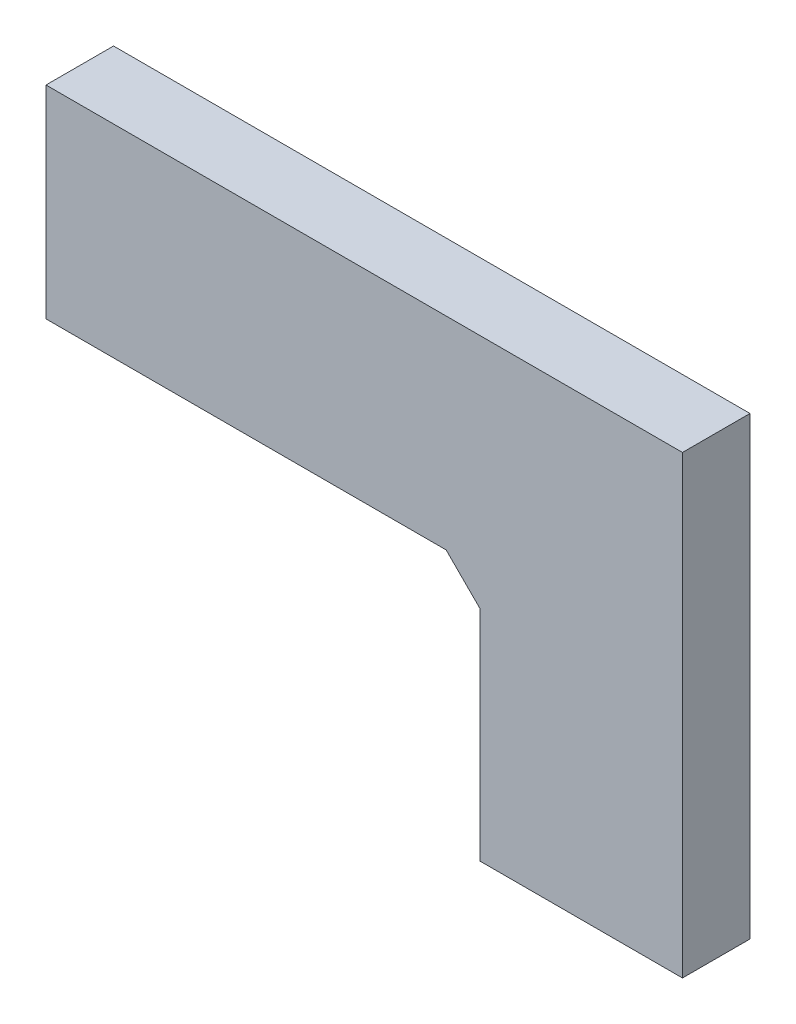
ISO-10303-21;
HEADER;
FILE_DESCRIPTION(('STEP AP214'),'2;1');
FILE_NAME('part.step','',(''),(''),'','','');
FILE_SCHEMA(('AUTOMOTIVE_DESIGN { 1 0 10303 214 1 1 1 1 }'));
ENDSEC;
DATA;
#1=APPLICATION_CONTEXT('core data for automotive mechanical design processes');
#2=APPLICATION_PROTOCOL_DEFINITION('international standard','automotive_design',2000,#1);
#3=PRODUCT_CONTEXT('',#1,'mechanical');
#4=PRODUCT('Part','Part','',(#3));
#5=PRODUCT_RELATED_PRODUCT_CATEGORY('part','',(#4));
#6=PRODUCT_DEFINITION_FORMATION('','',#4);
#7=PRODUCT_DEFINITION_CONTEXT('part definition',#1,'design');
#8=PRODUCT_DEFINITION('design','',#6,#7);
#9=PRODUCT_DEFINITION_SHAPE('','',#8);
#10=(LENGTH_UNIT() NAMED_UNIT(*) SI_UNIT(.MILLI.,.METRE.));
#11=(NAMED_UNIT(*) PLANE_ANGLE_UNIT() SI_UNIT($,.RADIAN.));
#12=(NAMED_UNIT(*) SI_UNIT($,.STERADIAN.) SOLID_ANGLE_UNIT());
#13=UNCERTAINTY_MEASURE_WITH_UNIT(LENGTH_MEASURE(1.E-05),#10,'distance_accuracy_value','');
#14=(GEOMETRIC_REPRESENTATION_CONTEXT(3) GLOBAL_UNCERTAINTY_ASSIGNED_CONTEXT((#13)) GLOBAL_UNIT_ASSIGNED_CONTEXT((#10,
#11,#12)) REPRESENTATION_CONTEXT('',''));
#15=CARTESIAN_POINT('',(0.,0.,0.));
#16=DIRECTION('',(0.,0.,1.));
#17=DIRECTION('',(1.,0.,0.));
#18=AXIS2_PLACEMENT_3D('',#15,#16,#17);
#19=CARTESIAN_POINT('',(0.,0.,0.5));
#20=DIRECTION('',(0.,0.,1.));
#21=DIRECTION('',(1.,0.,0.));
#22=AXIS2_PLACEMENT_3D('',#19,#20,#21);
#23=PLANE('',#22);
#24=DIRECTION('',(0.,-1.,0.));
#25=VECTOR('',#24,1.);
#26=CARTESIAN_POINT('',(13.077499999997,0.,0.5));
#27=LINE('',#26,#25);
#28=CARTESIAN_POINT('',(13.077499999997,-0.62132034356386,0.5));
#29=VERTEX_POINT('',#28);
#30=CARTESIAN_POINT('',(13.077499999997,-2.2413203435652,0.5));
#31=VERTEX_POINT('',#30);
#32=EDGE_CURVE('E11',#29,#31,#27,.T.);
#33=ORIENTED_EDGE('',*,*,#32,.T.);
#34=DIRECTION('',(1.,0.,0.));
#35=VECTOR('',#34,1.);
#36=CARTESIAN_POINT('',(0.,-2.2413203435652,0.5));
#37=LINE('',#36,#35);
#38=CARTESIAN_POINT('',(14.5775000000007,-2.2413203435652,0.5));
#39=VERTEX_POINT('',#38);
#40=EDGE_CURVE('E24',#31,#39,#37,.T.);
#41=ORIENTED_EDGE('',*,*,#40,.T.);
#42=DIRECTION('',(0.,1.,0.));
#43=VECTOR('',#42,1.);
#44=CARTESIAN_POINT('',(14.5775000000007,0.,0.5));
#45=LINE('',#44,#43);
#46=CARTESIAN_POINT('',(14.5775000000007,1.1286796564445,0.5));
#47=VERTEX_POINT('',#46);
#48=EDGE_CURVE('E131',#39,#47,#45,.T.);
#49=ORIENTED_EDGE('',*,*,#48,.T.);
#50=DIRECTION('',(1.,0.,0.));
#51=VECTOR('',#50,1.);
#52=CARTESIAN_POINT('',(0.,1.1286796564445,0.5));
#53=LINE('',#52,#51);
#54=CARTESIAN_POINT('',(9.8650000000006,1.1286796564445,0.5));
#55=VERTEX_POINT('',#54);
#56=EDGE_CURVE('E129',#55,#47,#53,.T.);
#57=ORIENTED_EDGE('',*,*,#56,.F.);
#58=DIRECTION('',(0.,-1.,0.));
#59=VECTOR('',#58,1.);
#60=CARTESIAN_POINT('',(9.8650000000007,0.,0.5));
#61=LINE('',#60,#59);
#62=CARTESIAN_POINT('',(9.8650000000007,-0.371320343562329,0.5));
#63=VERTEX_POINT('',#62);
#64=EDGE_CURVE('E96',#55,#63,#61,.T.);
#65=ORIENTED_EDGE('',*,*,#64,.T.);
#66=DIRECTION('',(1.,0.,0.));
#67=VECTOR('',#66,1.);
#68=CARTESIAN_POINT('',(0.,-0.371320343562327,0.5));
#69=LINE('',#68,#67);
#70=CARTESIAN_POINT('',(12.8274999999955,-0.37132034356233,0.5));
#71=VERTEX_POINT('',#70);
#72=EDGE_CURVE('E126',#63,#71,#69,.T.);
#73=ORIENTED_EDGE('',*,*,#72,.T.);
#74=DIRECTION('',(0.70710678118655,-0.707106781186545,0.));
#75=VECTOR('',#74,1.);
#76=CARTESIAN_POINT('',(6.2280898282165,6.2280898282166,0.5));
#77=LINE('',#76,#75);
#78=EDGE_CURVE('E124',#71,#29,#77,.T.);
#79=ORIENTED_EDGE('',*,*,#78,.T.);
#80=EDGE_LOOP('',(#33,#41,#49,#57,#65,#73,#79));
#81=FACE_BOUND('',#80,.T.);
#82=ADVANCED_FACE('F17',(#81),#23,.T.);
#83=CARTESIAN_POINT('',(14.5775000000007,0.,0.5));
#84=DIRECTION('',(-1.,0.,0.));
#85=DIRECTION('',(0.,-1.,0.));
#86=AXIS2_PLACEMENT_3D('',#83,#84,#85);
#87=PLANE('',#86);
#88=DIRECTION('',(0.,0.,1.));
#89=VECTOR('',#88,1.);
#90=CARTESIAN_POINT('',(14.5775000000007,-2.2413203435652,0.5));
#91=LINE('',#90,#89);
#92=CARTESIAN_POINT('',(14.5775000000007,-2.2413203435652,0.));
#93=VERTEX_POINT('',#92);
#94=EDGE_CURVE('E121',#93,#39,#91,.T.);
#95=ORIENTED_EDGE('',*,*,#94,.F.);
#96=DIRECTION('',(0.,1.,0.));
#97=VECTOR('',#96,1.);
#98=CARTESIAN_POINT('',(14.5775000000007,0.,0.));
#99=LINE('',#98,#97);
#100=CARTESIAN_POINT('',(14.5775000000007,1.1286796564445,0.));
#101=VERTEX_POINT('',#100);
#102=EDGE_CURVE('E119',#93,#101,#99,.T.);
#103=ORIENTED_EDGE('',*,*,#102,.T.);
#104=DIRECTION('',(0.,0.,-1.));
#105=VECTOR('',#104,1.);
#106=CARTESIAN_POINT('',(14.5775000000007,1.1286796564445,0.5));
#107=LINE('',#106,#105);
#108=EDGE_CURVE('E91',#47,#101,#107,.T.);
#109=ORIENTED_EDGE('',*,*,#108,.F.);
#110=ORIENTED_EDGE('',*,*,#48,.F.);
#111=EDGE_LOOP('',(#95,#103,#109,#110));
#112=FACE_BOUND('',#111,.T.);
#113=ADVANCED_FACE('F135',(#112),#87,.F.);
#114=CARTESIAN_POINT('',(0.,0.,0.));
#115=DIRECTION('',(0.,0.,1.));
#116=DIRECTION('',(1.,0.,0.));
#117=AXIS2_PLACEMENT_3D('',#114,#115,#116);
#118=PLANE('',#117);
#119=DIRECTION('',(1.,0.,0.));
#120=VECTOR('',#119,1.);
#121=CARTESIAN_POINT('',(0.,-2.2413203435652,0.));
#122=LINE('',#121,#120);
#123=CARTESIAN_POINT('',(13.077499999997,-2.2413203435652,0.));
#124=VERTEX_POINT('',#123);
#125=EDGE_CURVE('E115',#124,#93,#122,.T.);
#126=ORIENTED_EDGE('',*,*,#125,.F.);
#127=DIRECTION('',(0.,-1.,0.));
#128=VECTOR('',#127,1.);
#129=CARTESIAN_POINT('',(13.077499999997,0.,0.));
#130=LINE('',#129,#128);
#131=CARTESIAN_POINT('',(13.077499999997,-0.62132034356386,0.));
#132=VERTEX_POINT('',#131);
#133=EDGE_CURVE('E112',#132,#124,#130,.T.);
#134=ORIENTED_EDGE('',*,*,#133,.F.);
#135=DIRECTION('',(0.70710678118655,-0.707106781186545,0.));
#136=VECTOR('',#135,1.);
#137=CARTESIAN_POINT('',(6.2280898282165,6.2280898282166,0.));
#138=LINE('',#137,#136);
#139=CARTESIAN_POINT('',(12.8274999999955,-0.37132034356233,0.));
#140=VERTEX_POINT('',#139);
#141=EDGE_CURVE('E109',#140,#132,#138,.T.);
#142=ORIENTED_EDGE('',*,*,#141,.F.);
#143=DIRECTION('',(1.,0.,0.));
#144=VECTOR('',#143,1.);
#145=CARTESIAN_POINT('',(0.,-0.371320343562327,0.));
#146=LINE('',#145,#144);
#147=CARTESIAN_POINT('',(9.8650000000007,-0.371320343562329,0.));
#148=VERTEX_POINT('',#147);
#149=EDGE_CURVE('E78',#148,#140,#146,.T.);
#150=ORIENTED_EDGE('',*,*,#149,.F.);
#151=DIRECTION('',(0.,-1.,0.));
#152=VECTOR('',#151,1.);
#153=CARTESIAN_POINT('',(9.8650000000007,0.,0.));
#154=LINE('',#153,#152);
#155=CARTESIAN_POINT('',(9.8650000000006,1.1286796564445,0.));
#156=VERTEX_POINT('',#155);
#157=EDGE_CURVE('E72',#156,#148,#154,.T.);
#158=ORIENTED_EDGE('',*,*,#157,.F.);
#159=DIRECTION('',(1.,0.,0.));
#160=VECTOR('',#159,1.);
#161=CARTESIAN_POINT('',(0.,1.1286796564445,0.));
#162=LINE('',#161,#160);
#163=EDGE_CURVE('E76',#156,#101,#162,.T.);
#164=ORIENTED_EDGE('',*,*,#163,.T.);
#165=ORIENTED_EDGE('',*,*,#102,.F.);
#166=EDGE_LOOP('',(#126,#134,#142,#150,#158,#164,#165));
#167=FACE_BOUND('',#166,.T.);
#168=ADVANCED_FACE('F74',(#167),#118,.F.);
#169=CARTESIAN_POINT('',(13.077499999997,0.,0.5));
#170=DIRECTION('',(1.,0.,0.));
#171=DIRECTION('',(0.,0.,-1.));
#172=AXIS2_PLACEMENT_3D('',#169,#170,#171);
#173=PLANE('',#172);
#174=DIRECTION('',(0.,0.,-1.));
#175=VECTOR('',#174,1.);
#176=CARTESIAN_POINT('',(13.077499999997,-2.2413203435652,0.5));
#177=LINE('',#176,#175);
#178=EDGE_CURVE('E92',#31,#124,#177,.T.);
#179=ORIENTED_EDGE('',*,*,#178,.F.);
#180=ORIENTED_EDGE('',*,*,#32,.F.);
#181=DIRECTION('',(0.,0.,-1.));
#182=VECTOR('',#181,1.);
#183=CARTESIAN_POINT('',(13.077499999997,-0.62132034356386,0.5));
#184=LINE('',#183,#182);
#185=EDGE_CURVE('E104',#29,#132,#184,.T.);
#186=ORIENTED_EDGE('',*,*,#185,.T.);
#187=ORIENTED_EDGE('',*,*,#133,.T.);
#188=EDGE_LOOP('',(#179,#180,#186,#187));
#189=FACE_BOUND('',#188,.T.);
#190=ADVANCED_FACE('F137',(#189),#173,.F.);
#191=CARTESIAN_POINT('',(6.2280898282165,6.2280898282166,0.5));
#192=DIRECTION('',(0.707106781186545,0.70710678118655,0.));
#193=DIRECTION('',(-0.70710678118655,0.707106781186545,0.));
#194=AXIS2_PLACEMENT_3D('',#191,#192,#193);
#195=PLANE('',#194);
#196=ORIENTED_EDGE('',*,*,#141,.T.);
#197=ORIENTED_EDGE('',*,*,#185,.F.);
#198=ORIENTED_EDGE('',*,*,#78,.F.);
#199=DIRECTION('',(0.,0.,-1.));
#200=VECTOR('',#199,1.);
#201=CARTESIAN_POINT('',(12.8274999999955,-0.37132034356233,0.5));
#202=LINE('',#201,#200);
#203=EDGE_CURVE('E99',#71,#140,#202,.T.);
#204=ORIENTED_EDGE('',*,*,#203,.T.);
#205=EDGE_LOOP('',(#196,#197,#198,#204));
#206=FACE_BOUND('',#205,.T.);
#207=ADVANCED_FACE('F141',(#206),#195,.F.);
#208=CARTESIAN_POINT('',(0.,-0.371320343562327,0.5));
#209=DIRECTION('',(0.,1.,0.));
#210=DIRECTION('',(-1.,0.,0.));
#211=AXIS2_PLACEMENT_3D('',#208,#209,#210);
#212=PLANE('',#211);
#213=ORIENTED_EDGE('',*,*,#149,.T.);
#214=ORIENTED_EDGE('',*,*,#203,.F.);
#215=ORIENTED_EDGE('',*,*,#72,.F.);
#216=DIRECTION('',(0.,0.,-1.));
#217=VECTOR('',#216,1.);
#218=CARTESIAN_POINT('',(9.8650000000007,-0.371320343562329,0.5));
#219=LINE('',#218,#217);
#220=EDGE_CURVE('E97',#63,#148,#219,.T.);
#221=ORIENTED_EDGE('',*,*,#220,.T.);
#222=EDGE_LOOP('',(#213,#214,#215,#221));
#223=FACE_BOUND('',#222,.T.);
#224=ADVANCED_FACE('F144',(#223),#212,.F.);
#225=CARTESIAN_POINT('',(9.8650000000007,0.,0.5));
#226=DIRECTION('',(1.,0.,0.));
#227=DIRECTION('',(0.,1.,0.));
#228=AXIS2_PLACEMENT_3D('',#225,#226,#227);
#229=PLANE('',#228);
#230=ORIENTED_EDGE('',*,*,#157,.T.);
#231=ORIENTED_EDGE('',*,*,#220,.F.);
#232=ORIENTED_EDGE('',*,*,#64,.F.);
#233=DIRECTION('',(0.,0.,-1.));
#234=VECTOR('',#233,1.);
#235=CARTESIAN_POINT('',(9.8650000000006,1.1286796564445,0.5));
#236=LINE('',#235,#234);
#237=EDGE_CURVE('E89',#55,#156,#236,.T.);
#238=ORIENTED_EDGE('',*,*,#237,.T.);
#239=EDGE_LOOP('',(#230,#231,#232,#238));
#240=FACE_BOUND('',#239,.T.);
#241=ADVANCED_FACE('F95',(#240),#229,.F.);
#242=CARTESIAN_POINT('',(0.,1.1286796564445,0.5));
#243=DIRECTION('',(0.,1.,0.));
#244=DIRECTION('',(0.,0.,1.));
#245=AXIS2_PLACEMENT_3D('',#242,#243,#244);
#246=PLANE('',#245);
#247=ORIENTED_EDGE('',*,*,#163,.F.);
#248=ORIENTED_EDGE('',*,*,#237,.F.);
#249=ORIENTED_EDGE('',*,*,#56,.T.);
#250=ORIENTED_EDGE('',*,*,#108,.T.);
#251=EDGE_LOOP('',(#247,#248,#249,#250));
#252=FACE_BOUND('',#251,.T.);
#253=ADVANCED_FACE('F87',(#252),#246,.T.);
#254=CARTESIAN_POINT('',(3.88578058618805E-13,-2.2413203435652,-0.01));
#255=DIRECTION('',(0.,-1.,0.));
#256=DIRECTION('',(1.,0.,0.));
#257=AXIS2_PLACEMENT_3D('',#254,#255,#256);
#258=PLANE('',#257);
#259=ORIENTED_EDGE('',*,*,#40,.F.);
#260=ORIENTED_EDGE('',*,*,#178,.T.);
#261=ORIENTED_EDGE('',*,*,#125,.T.);
#262=ORIENTED_EDGE('',*,*,#94,.T.);
#263=EDGE_LOOP('',(#259,#260,#261,#262));
#264=FACE_BOUND('',#263,.T.);
#265=ADVANCED_FACE('F136',(#264),#258,.T.);
#266=CLOSED_SHELL('',(#82,#113,#168,#190,#207,#224,#241,#253,#265));
#267=MANIFOLD_SOLID_BREP('B1',#266);
#268=ADVANCED_BREP_SHAPE_REPRESENTATION('',(#18,#267),#14);
#269=SHAPE_DEFINITION_REPRESENTATION(#9,#268);
ENDSEC;
END-ISO-10303-21;
